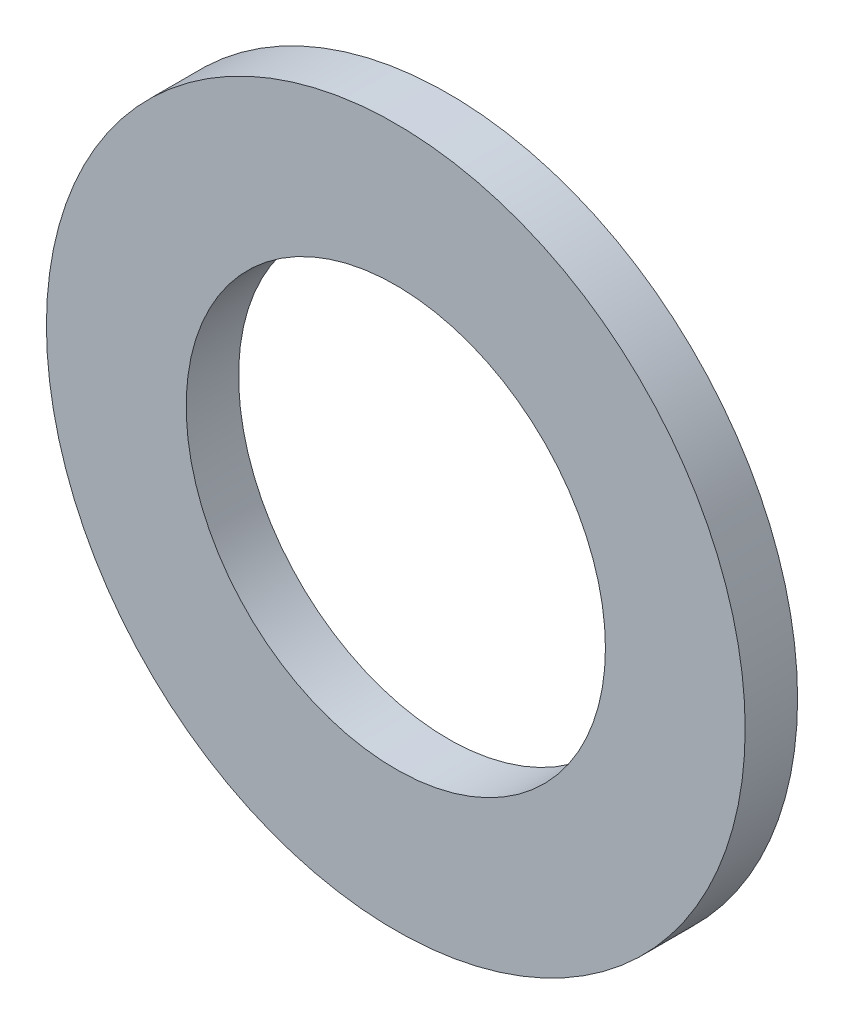
ISO-10303-21;
HEADER;
FILE_DESCRIPTION(('STEP AP214'),'2;1');
FILE_NAME('part.step','',(''),(''),'','','');
FILE_SCHEMA(('AUTOMOTIVE_DESIGN { 1 0 10303 214 1 1 1 1 }'));
ENDSEC;
DATA;
#1=APPLICATION_CONTEXT('core data for automotive mechanical design processes');
#2=APPLICATION_PROTOCOL_DEFINITION('international standard','automotive_design',2000,#1);
#3=PRODUCT_CONTEXT('',#1,'mechanical');
#4=PRODUCT('Part','Part','',(#3));
#5=PRODUCT_RELATED_PRODUCT_CATEGORY('part','',(#4));
#6=PRODUCT_DEFINITION_FORMATION('','',#4);
#7=PRODUCT_DEFINITION_CONTEXT('part definition',#1,'design');
#8=PRODUCT_DEFINITION('design','',#6,#7);
#9=PRODUCT_DEFINITION_SHAPE('','',#8);
#10=(LENGTH_UNIT() NAMED_UNIT(*) SI_UNIT(.MILLI.,.METRE.));
#11=(NAMED_UNIT(*) PLANE_ANGLE_UNIT() SI_UNIT($,.RADIAN.));
#12=(NAMED_UNIT(*) SI_UNIT($,.STERADIAN.) SOLID_ANGLE_UNIT());
#13=UNCERTAINTY_MEASURE_WITH_UNIT(LENGTH_MEASURE(1.E-05),#10,'distance_accuracy_value','');
#14=(GEOMETRIC_REPRESENTATION_CONTEXT(3) GLOBAL_UNCERTAINTY_ASSIGNED_CONTEXT((#13)) GLOBAL_UNIT_ASSIGNED_CONTEXT((#10,
#11,#12)) REPRESENTATION_CONTEXT('',''));
#15=CARTESIAN_POINT('',(0.,0.,0.));
#16=DIRECTION('',(0.,0.,1.));
#17=DIRECTION('',(1.,0.,0.));
#18=AXIS2_PLACEMENT_3D('',#15,#16,#17);
#19=CARTESIAN_POINT('',(0.,0.,1.5));
#20=DIRECTION('',(0.,0.,1.));
#21=DIRECTION('',(1.,0.,0.));
#22=AXIS2_PLACEMENT_3D('',#19,#20,#21);
#23=PLANE('',#22);
#24=CARTESIAN_POINT('',(0.,0.,1.5));
#25=DIRECTION('',(0.,0.,1.));
#26=DIRECTION('',(1.,0.,0.));
#27=AXIS2_PLACEMENT_3D('',#24,#25,#26);
#28=CIRCLE('',#27,10.);
#29=CARTESIAN_POINT('',(10.,0.,1.5));
#30=VERTEX_POINT('',#29);
#31=EDGE_CURVE('E10',#30,#30,#28,.T.);
#32=ORIENTED_EDGE('',*,*,#31,.T.);
#33=EDGE_LOOP('',(#32));
#34=FACE_BOUND('',#33,.T.);
#35=CARTESIAN_POINT('',(0.,0.,1.5));
#36=DIRECTION('',(0.,0.,1.));
#37=DIRECTION('',(1.,0.,0.));
#38=AXIS2_PLACEMENT_3D('',#35,#36,#37);
#39=CIRCLE('',#38,6.);
#40=CARTESIAN_POINT('',(6.,0.,1.5));
#41=VERTEX_POINT('',#40);
#42=EDGE_CURVE('E41',#41,#41,#39,.T.);
#43=ORIENTED_EDGE('',*,*,#42,.F.);
#44=EDGE_LOOP('',(#43));
#45=FACE_BOUND('',#44,.T.);
#46=ADVANCED_FACE('F30',(#34,#45),#23,.T.);
#47=CARTESIAN_POINT('',(0.,0.,0.));
#48=DIRECTION('',(0.,0.,1.));
#49=DIRECTION('',(1.,0.,0.));
#50=AXIS2_PLACEMENT_3D('',#47,#48,#49);
#51=PLANE('',#50);
#52=CARTESIAN_POINT('',(0.,0.,0.));
#53=DIRECTION('',(0.,0.,1.));
#54=DIRECTION('',(1.,0.,0.));
#55=AXIS2_PLACEMENT_3D('',#52,#53,#54);
#56=CIRCLE('',#55,10.);
#57=CARTESIAN_POINT('',(10.,0.,0.));
#58=VERTEX_POINT('',#57);
#59=EDGE_CURVE('E34',#58,#58,#56,.T.);
#60=ORIENTED_EDGE('',*,*,#59,.F.);
#61=EDGE_LOOP('',(#60));
#62=FACE_BOUND('',#61,.T.);
#63=CARTESIAN_POINT('',(0.,0.,0.));
#64=DIRECTION('',(0.,0.,1.));
#65=DIRECTION('',(1.,0.,0.));
#66=AXIS2_PLACEMENT_3D('',#63,#64,#65);
#67=CIRCLE('',#66,6.);
#68=CARTESIAN_POINT('',(6.,0.,0.));
#69=VERTEX_POINT('',#68);
#70=EDGE_CURVE('E43',#69,#69,#67,.T.);
#71=ORIENTED_EDGE('',*,*,#70,.T.);
#72=EDGE_LOOP('',(#71));
#73=FACE_BOUND('',#72,.T.);
#74=ADVANCED_FACE('F53',(#62,#73),#51,.F.);
#75=CARTESIAN_POINT('',(0.,0.,1.5));
#76=DIRECTION('',(0.,0.,-1.));
#77=DIRECTION('',(-1.,0.,0.));
#78=AXIS2_PLACEMENT_3D('',#75,#76,#77);
#79=CYLINDRICAL_SURFACE('',#78,10.);
#80=ORIENTED_EDGE('',*,*,#31,.F.);
#81=EDGE_LOOP('',(#80));
#82=FACE_BOUND('',#81,.T.);
#83=ORIENTED_EDGE('',*,*,#59,.T.);
#84=EDGE_LOOP('',(#83));
#85=FACE_BOUND('',#84,.T.);
#86=ADVANCED_FACE('F32',(#82,#85),#79,.T.);
#87=CARTESIAN_POINT('',(0.,0.,1.5));
#88=DIRECTION('',(0.,0.,-1.));
#89=DIRECTION('',(-1.,0.,0.));
#90=AXIS2_PLACEMENT_3D('',#87,#88,#89);
#91=CYLINDRICAL_SURFACE('',#90,6.);
#92=ORIENTED_EDGE('',*,*,#42,.T.);
#93=EDGE_LOOP('',(#92));
#94=FACE_BOUND('',#93,.T.);
#95=ORIENTED_EDGE('',*,*,#70,.F.);
#96=EDGE_LOOP('',(#95));
#97=FACE_BOUND('',#96,.T.);
#98=ADVANCED_FACE('F49',(#94,#97),#91,.F.);
#99=CLOSED_SHELL('',(#46,#74,#86,#98));
#100=MANIFOLD_SOLID_BREP('B2',#99);
#101=ADVANCED_BREP_SHAPE_REPRESENTATION('',(#18,#100),#14);
#102=SHAPE_DEFINITION_REPRESENTATION(#9,#101);
ENDSEC;
END-ISO-10303-21;
